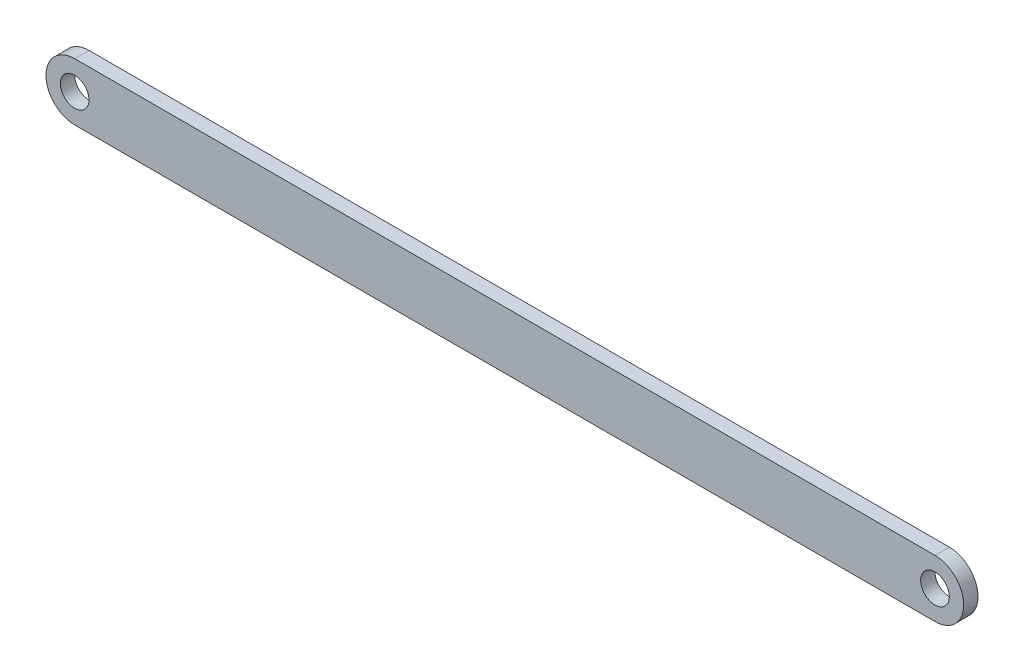
ISO-10303-21;
HEADER;
FILE_DESCRIPTION(('STEP AP214'),'2;1');
FILE_NAME('part.step','',(''),(''),'','','');
FILE_SCHEMA(('AUTOMOTIVE_DESIGN { 1 0 10303 214 1 1 1 1 }'));
ENDSEC;
DATA;
#1=APPLICATION_CONTEXT('core data for automotive mechanical design processes');
#2=APPLICATION_PROTOCOL_DEFINITION('international standard','automotive_design',2000,#1);
#3=PRODUCT_CONTEXT('',#1,'mechanical');
#4=PRODUCT('Part','Part','',(#3));
#5=PRODUCT_RELATED_PRODUCT_CATEGORY('part','',(#4));
#6=PRODUCT_DEFINITION_FORMATION('','',#4);
#7=PRODUCT_DEFINITION_CONTEXT('part definition',#1,'design');
#8=PRODUCT_DEFINITION('design','',#6,#7);
#9=PRODUCT_DEFINITION_SHAPE('','',#8);
#10=(LENGTH_UNIT() NAMED_UNIT(*) SI_UNIT(.MILLI.,.METRE.));
#11=(NAMED_UNIT(*) PLANE_ANGLE_UNIT() SI_UNIT($,.RADIAN.));
#12=(NAMED_UNIT(*) SI_UNIT($,.STERADIAN.) SOLID_ANGLE_UNIT());
#13=UNCERTAINTY_MEASURE_WITH_UNIT(LENGTH_MEASURE(1.E-05),#10,'distance_accuracy_value','');
#14=(GEOMETRIC_REPRESENTATION_CONTEXT(3) GLOBAL_UNCERTAINTY_ASSIGNED_CONTEXT((#13)) GLOBAL_UNIT_ASSIGNED_CONTEXT((#10,
#11,#12)) REPRESENTATION_CONTEXT('',''));
#15=CARTESIAN_POINT('',(0.,0.,0.));
#16=DIRECTION('',(0.,0.,1.));
#17=DIRECTION('',(1.,0.,0.));
#18=AXIS2_PLACEMENT_3D('',#15,#16,#17);
#19=CARTESIAN_POINT('',(-952.5,0.,31.75));
#20=DIRECTION('',(0.,0.,-1.));
#21=DIRECTION('',(-1.,0.,0.));
#22=AXIS2_PLACEMENT_3D('',#19,#20,#21);
#23=CYLINDRICAL_SURFACE('',#22,63.4999999999999);
#24=CARTESIAN_POINT('',(-952.5,0.,0.));
#25=DIRECTION('',(0.,0.,1.));
#26=DIRECTION('',(1.,0.,0.));
#27=AXIS2_PLACEMENT_3D('',#24,#25,#26);
#28=CIRCLE('',#27,63.4999999999999);
#29=CARTESIAN_POINT('',(-952.5,63.4999999999999,0.));
#30=VERTEX_POINT('',#29);
#31=CARTESIAN_POINT('',(-952.5,-63.4999999999999,0.));
#32=VERTEX_POINT('',#31);
#33=EDGE_CURVE('E96',#30,#32,#28,.T.);
#34=ORIENTED_EDGE('',*,*,#33,.T.);
#35=DIRECTION('',(0.,0.,-1.));
#36=VECTOR('',#35,1.);
#37=CARTESIAN_POINT('',(-952.5,-63.4999999999999,31.75));
#38=LINE('',#37,#36);
#39=CARTESIAN_POINT('',(-952.5,-63.4999999999999,31.75));
#40=VERTEX_POINT('',#39);
#41=EDGE_CURVE('E11',#40,#32,#38,.T.);
#42=ORIENTED_EDGE('',*,*,#41,.F.);
#43=CARTESIAN_POINT('',(-952.5,0.,31.75));
#44=DIRECTION('',(0.,0.,1.));
#45=DIRECTION('',(1.,0.,0.));
#46=AXIS2_PLACEMENT_3D('',#43,#44,#45);
#47=CIRCLE('',#46,63.4999999999999);
#48=CARTESIAN_POINT('',(-952.5,63.4999999999999,31.75));
#49=VERTEX_POINT('',#48);
#50=EDGE_CURVE('E84',#49,#40,#47,.T.);
#51=ORIENTED_EDGE('',*,*,#50,.F.);
#52=DIRECTION('',(0.,0.,-1.));
#53=VECTOR('',#52,1.);
#54=CARTESIAN_POINT('',(-952.5,63.4999999999999,31.75));
#55=LINE('',#54,#53);
#56=EDGE_CURVE('E92',#49,#30,#55,.T.);
#57=ORIENTED_EDGE('',*,*,#56,.T.);
#58=EDGE_LOOP('',(#34,#42,#51,#57));
#59=FACE_BOUND('',#58,.T.);
#60=ADVANCED_FACE('F33',(#59),#23,.T.);
#61=CARTESIAN_POINT('',(-952.5,-63.4999999999999,31.75));
#62=DIRECTION('',(0.,1.,0.));
#63=DIRECTION('',(0.,0.,1.));
#64=AXIS2_PLACEMENT_3D('',#61,#62,#63);
#65=PLANE('',#64);
#66=DIRECTION('',(1.,0.,0.));
#67=VECTOR('',#66,1.);
#68=CARTESIAN_POINT('',(-952.5,-63.4999999999999,0.));
#69=LINE('',#68,#67);
#70=CARTESIAN_POINT('',(952.5,-63.5,0.));
#71=VERTEX_POINT('',#70);
#72=EDGE_CURVE('E88',#32,#71,#69,.T.);
#73=ORIENTED_EDGE('',*,*,#72,.T.);
#74=DIRECTION('',(0.,0.,-1.));
#75=VECTOR('',#74,1.);
#76=CARTESIAN_POINT('',(952.5,-63.5,31.75));
#77=LINE('',#76,#75);
#78=CARTESIAN_POINT('',(952.5,-63.5,31.75));
#79=VERTEX_POINT('',#78);
#80=EDGE_CURVE('E41',#79,#71,#77,.T.);
#81=ORIENTED_EDGE('',*,*,#80,.F.);
#82=DIRECTION('',(1.,0.,0.));
#83=VECTOR('',#82,1.);
#84=CARTESIAN_POINT('',(-952.5,-63.4999999999999,31.75));
#85=LINE('',#84,#83);
#86=EDGE_CURVE('E79',#40,#79,#85,.T.);
#87=ORIENTED_EDGE('',*,*,#86,.F.);
#88=ORIENTED_EDGE('',*,*,#41,.T.);
#89=EDGE_LOOP('',(#73,#81,#87,#88));
#90=FACE_BOUND('',#89,.T.);
#91=ADVANCED_FACE('F87',(#90),#65,.F.);
#92=CARTESIAN_POINT('',(952.5,0.,31.75));
#93=DIRECTION('',(0.,0.,-1.));
#94=DIRECTION('',(-1.,0.,0.));
#95=AXIS2_PLACEMENT_3D('',#92,#93,#94);
#96=CYLINDRICAL_SURFACE('',#95,63.4999999999999);
#97=CARTESIAN_POINT('',(952.5,0.,0.));
#98=DIRECTION('',(0.,0.,1.));
#99=DIRECTION('',(1.,0.,0.));
#100=AXIS2_PLACEMENT_3D('',#97,#98,#99);
#101=CIRCLE('',#100,63.4999999999999);
#102=CARTESIAN_POINT('',(952.5,63.4999999999999,0.));
#103=VERTEX_POINT('',#102);
#104=EDGE_CURVE('E66',#71,#103,#101,.T.);
#105=ORIENTED_EDGE('',*,*,#104,.T.);
#106=DIRECTION('',(0.,0.,-1.));
#107=VECTOR('',#106,1.);
#108=CARTESIAN_POINT('',(952.5,63.4999999999999,31.75));
#109=LINE('',#108,#107);
#110=CARTESIAN_POINT('',(952.5,63.4999999999999,31.75));
#111=VERTEX_POINT('',#110);
#112=EDGE_CURVE('E89',#111,#103,#109,.T.);
#113=ORIENTED_EDGE('',*,*,#112,.F.);
#114=CARTESIAN_POINT('',(952.5,0.,31.75));
#115=DIRECTION('',(0.,0.,1.));
#116=DIRECTION('',(1.,0.,0.));
#117=AXIS2_PLACEMENT_3D('',#114,#115,#116);
#118=CIRCLE('',#117,63.4999999999999);
#119=EDGE_CURVE('E82',#79,#111,#118,.T.);
#120=ORIENTED_EDGE('',*,*,#119,.F.);
#121=ORIENTED_EDGE('',*,*,#80,.T.);
#122=EDGE_LOOP('',(#105,#113,#120,#121));
#123=FACE_BOUND('',#122,.T.);
#124=ADVANCED_FACE('F90',(#123),#96,.T.);
#125=CARTESIAN_POINT('',(-952.5,63.4999999999999,31.75));
#126=DIRECTION('',(0.,-1.,0.));
#127=DIRECTION('',(0.,0.,-1.));
#128=AXIS2_PLACEMENT_3D('',#125,#126,#127);
#129=PLANE('',#128);
#130=DIRECTION('',(-1.,0.,0.));
#131=VECTOR('',#130,1.);
#132=CARTESIAN_POINT('',(-952.5,63.4999999999999,0.));
#133=LINE('',#132,#131);
#134=EDGE_CURVE('E72',#103,#30,#133,.T.);
#135=ORIENTED_EDGE('',*,*,#134,.T.);
#136=ORIENTED_EDGE('',*,*,#56,.F.);
#137=DIRECTION('',(-1.,0.,0.));
#138=VECTOR('',#137,1.);
#139=CARTESIAN_POINT('',(-952.5,63.4999999999999,31.75));
#140=LINE('',#139,#138);
#141=EDGE_CURVE('E49',#111,#49,#140,.T.);
#142=ORIENTED_EDGE('',*,*,#141,.F.);
#143=ORIENTED_EDGE('',*,*,#112,.T.);
#144=EDGE_LOOP('',(#135,#136,#142,#143));
#145=FACE_BOUND('',#144,.T.);
#146=ADVANCED_FACE('F104',(#145),#129,.F.);
#147=CARTESIAN_POINT('',(-952.5,0.,31.75));
#148=DIRECTION('',(0.,0.,1.));
#149=DIRECTION('',(1.,0.,0.));
#150=AXIS2_PLACEMENT_3D('',#147,#148,#149);
#151=PLANE('',#150);
#152=CARTESIAN_POINT('',(-952.5,0.,31.75));
#153=DIRECTION('',(0.,0.,1.));
#154=DIRECTION('',(1.,0.,0.));
#155=AXIS2_PLACEMENT_3D('',#152,#153,#154);
#156=CIRCLE('',#155,31.75);
#157=CARTESIAN_POINT('',(-920.75,0.,31.75));
#158=VERTEX_POINT('',#157);
#159=EDGE_CURVE('E116',#158,#158,#156,.T.);
#160=ORIENTED_EDGE('',*,*,#159,.F.);
#161=EDGE_LOOP('',(#160));
#162=FACE_BOUND('',#161,.T.);
#163=CARTESIAN_POINT('',(952.5,0.,31.75));
#164=DIRECTION('',(0.,0.,1.));
#165=DIRECTION('',(1.,0.,0.));
#166=AXIS2_PLACEMENT_3D('',#163,#164,#165);
#167=CIRCLE('',#166,31.75);
#168=CARTESIAN_POINT('',(984.25,0.,31.75));
#169=VERTEX_POINT('',#168);
#170=EDGE_CURVE('E110',#169,#169,#167,.T.);
#171=ORIENTED_EDGE('',*,*,#170,.F.);
#172=EDGE_LOOP('',(#171));
#173=FACE_BOUND('',#172,.T.);
#174=ORIENTED_EDGE('',*,*,#50,.T.);
#175=ORIENTED_EDGE('',*,*,#86,.T.);
#176=ORIENTED_EDGE('',*,*,#119,.T.);
#177=ORIENTED_EDGE('',*,*,#141,.T.);
#178=EDGE_LOOP('',(#174,#175,#176,#177));
#179=FACE_BOUND('',#178,.T.);
#180=ADVANCED_FACE('F80',(#162,#173,#179),#151,.T.);
#181=CARTESIAN_POINT('',(-952.5,0.,0.));
#182=DIRECTION('',(0.,0.,1.));
#183=DIRECTION('',(1.,0.,0.));
#184=AXIS2_PLACEMENT_3D('',#181,#182,#183);
#185=PLANE('',#184);
#186=CARTESIAN_POINT('',(-952.5,0.,0.));
#187=DIRECTION('',(0.,0.,1.));
#188=DIRECTION('',(1.,0.,0.));
#189=AXIS2_PLACEMENT_3D('',#186,#187,#188);
#190=CIRCLE('',#189,31.75);
#191=CARTESIAN_POINT('',(-920.75,0.,0.));
#192=VERTEX_POINT('',#191);
#193=EDGE_CURVE('E99',#192,#192,#190,.T.);
#194=ORIENTED_EDGE('',*,*,#193,.T.);
#195=EDGE_LOOP('',(#194));
#196=FACE_BOUND('',#195,.T.);
#197=CARTESIAN_POINT('',(952.5,0.,0.));
#198=DIRECTION('',(0.,0.,1.));
#199=DIRECTION('',(1.,0.,0.));
#200=AXIS2_PLACEMENT_3D('',#197,#198,#199);
#201=CIRCLE('',#200,31.75);
#202=CARTESIAN_POINT('',(984.25,0.,0.));
#203=VERTEX_POINT('',#202);
#204=EDGE_CURVE('E113',#203,#203,#201,.T.);
#205=ORIENTED_EDGE('',*,*,#204,.T.);
#206=EDGE_LOOP('',(#205));
#207=FACE_BOUND('',#206,.T.);
#208=ORIENTED_EDGE('',*,*,#33,.F.);
#209=ORIENTED_EDGE('',*,*,#134,.F.);
#210=ORIENTED_EDGE('',*,*,#104,.F.);
#211=ORIENTED_EDGE('',*,*,#72,.F.);
#212=EDGE_LOOP('',(#208,#209,#210,#211));
#213=FACE_BOUND('',#212,.T.);
#214=ADVANCED_FACE('F107',(#196,#207,#213),#185,.F.);
#215=CARTESIAN_POINT('',(952.5,0.,0.));
#216=DIRECTION('',(0.,0.,1.));
#217=DIRECTION('',(1.,0.,0.));
#218=AXIS2_PLACEMENT_3D('',#215,#216,#217);
#219=CYLINDRICAL_SURFACE('',#218,31.75);
#220=ORIENTED_EDGE('',*,*,#204,.F.);
#221=EDGE_LOOP('',(#220));
#222=FACE_BOUND('',#221,.T.);
#223=ORIENTED_EDGE('',*,*,#170,.T.);
#224=EDGE_LOOP('',(#223));
#225=FACE_BOUND('',#224,.T.);
#226=ADVANCED_FACE('F127',(#222,#225),#219,.F.);
#227=CARTESIAN_POINT('',(-952.5,0.,0.));
#228=DIRECTION('',(0.,0.,1.));
#229=DIRECTION('',(1.,0.,0.));
#230=AXIS2_PLACEMENT_3D('',#227,#228,#229);
#231=CYLINDRICAL_SURFACE('',#230,31.75);
#232=ORIENTED_EDGE('',*,*,#193,.F.);
#233=EDGE_LOOP('',(#232));
#234=FACE_BOUND('',#233,.T.);
#235=ORIENTED_EDGE('',*,*,#159,.T.);
#236=EDGE_LOOP('',(#235));
#237=FACE_BOUND('',#236,.T.);
#238=ADVANCED_FACE('F124',(#234,#237),#231,.F.);
#239=CLOSED_SHELL('',(#60,#91,#124,#146,#180,#214,#226,#238));
#240=MANIFOLD_SOLID_BREP('B2',#239);
#241=ADVANCED_BREP_SHAPE_REPRESENTATION('',(#18,#240),#14);
#242=SHAPE_DEFINITION_REPRESENTATION(#9,#241);
ENDSEC;
END-ISO-10303-21;
